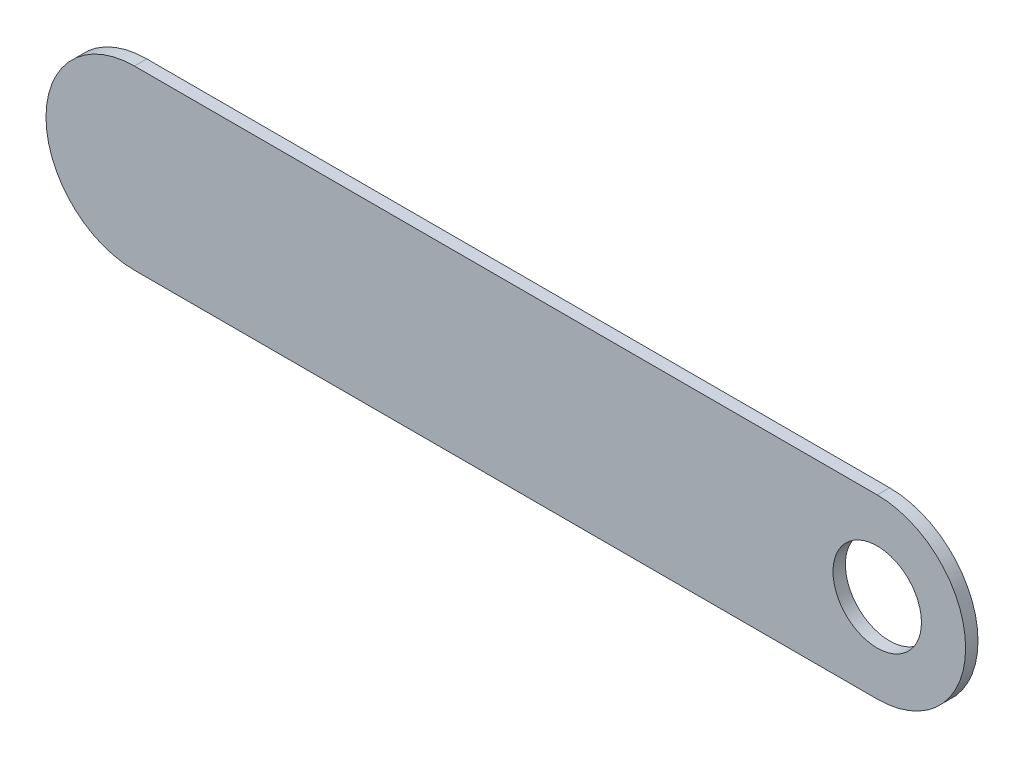
ISO-10303-21;
HEADER;
FILE_DESCRIPTION(('STEP AP214'),'2;1');
FILE_NAME('part.step','',(''),(''),'','','');
FILE_SCHEMA(('AUTOMOTIVE_DESIGN { 1 0 10303 214 1 1 1 1 }'));
ENDSEC;
DATA;
#1=APPLICATION_CONTEXT('core data for automotive mechanical design processes');
#2=APPLICATION_PROTOCOL_DEFINITION('international standard','automotive_design',2000,#1);
#3=PRODUCT_CONTEXT('',#1,'mechanical');
#4=PRODUCT('Part','Part','',(#3));
#5=PRODUCT_RELATED_PRODUCT_CATEGORY('part','',(#4));
#6=PRODUCT_DEFINITION_FORMATION('','',#4);
#7=PRODUCT_DEFINITION_CONTEXT('part definition',#1,'design');
#8=PRODUCT_DEFINITION('design','',#6,#7);
#9=PRODUCT_DEFINITION_SHAPE('','',#8);
#10=(LENGTH_UNIT() NAMED_UNIT(*) SI_UNIT(.MILLI.,.METRE.));
#11=(NAMED_UNIT(*) PLANE_ANGLE_UNIT() SI_UNIT($,.RADIAN.));
#12=(NAMED_UNIT(*) SI_UNIT($,.STERADIAN.) SOLID_ANGLE_UNIT());
#13=UNCERTAINTY_MEASURE_WITH_UNIT(LENGTH_MEASURE(1.E-05),#10,'distance_accuracy_value','');
#14=(GEOMETRIC_REPRESENTATION_CONTEXT(3) GLOBAL_UNCERTAINTY_ASSIGNED_CONTEXT((#13)) GLOBAL_UNIT_ASSIGNED_CONTEXT((#10,
#11,#12)) REPRESENTATION_CONTEXT('',''));
#15=CARTESIAN_POINT('',(0.,0.,0.));
#16=DIRECTION('',(0.,0.,1.));
#17=DIRECTION('',(1.,0.,0.));
#18=AXIS2_PLACEMENT_3D('',#15,#16,#17);
#19=CARTESIAN_POINT('',(94.25,-120.75,-0.045));
#20=DIRECTION('',(0.,0.,-1.));
#21=DIRECTION('',(0.,-1.,0.));
#22=AXIS2_PLACEMENT_3D('',#19,#20,#21);
#23=CYLINDRICAL_SURFACE('',#22,0.125);
#24=CARTESIAN_POINT('',(94.25,-120.75,-0.035));
#25=DIRECTION('',(0.,0.,-1.));
#26=DIRECTION('',(0.,-1.,0.));
#27=AXIS2_PLACEMENT_3D('',#24,#25,#26);
#28=CIRCLE('',#27,0.125);
#29=CARTESIAN_POINT('',(94.25,-120.875,-0.035));
#30=VERTEX_POINT('',#29);
#31=EDGE_CURVE('E76',#30,#30,#28,.T.);
#32=ORIENTED_EDGE('',*,*,#31,.T.);
#33=DIRECTION('',(0.,0.,1.));
#34=VECTOR('',#33,1.);
#35=CARTESIAN_POINT('',(94.25,-120.875,-0.045));
#36=LINE('',#35,#34);
#37=CARTESIAN_POINT('',(94.25,-120.875,0.));
#38=VERTEX_POINT('',#37);
#39=EDGE_CURVE('E11',#30,#38,#36,.T.);
#40=ORIENTED_EDGE('',*,*,#39,.T.);
#41=CARTESIAN_POINT('',(94.25,-120.75,0.));
#42=DIRECTION('',(0.,0.,-1.));
#43=DIRECTION('',(0.,-1.,0.));
#44=AXIS2_PLACEMENT_3D('',#41,#42,#43);
#45=CIRCLE('',#44,0.125);
#46=EDGE_CURVE('E20',#38,#38,#45,.T.);
#47=ORIENTED_EDGE('',*,*,#46,.F.);
#48=ORIENTED_EDGE('',*,*,#39,.F.);
#49=EDGE_LOOP('',(#32,#40,#47,#48));
#50=FACE_BOUND('',#49,.T.);
#51=ADVANCED_FACE('F17',(#50),#23,.F.);
#52=CARTESIAN_POINT('',(94.25,-120.5,-0.035));
#53=DIRECTION('',(0.,-1.,0.));
#54=DIRECTION('',(0.,0.,-1.));
#55=AXIS2_PLACEMENT_3D('',#52,#53,#54);
#56=PLANE('',#55);
#57=DIRECTION('',(-1.,0.,0.));
#58=VECTOR('',#57,1.);
#59=CARTESIAN_POINT('',(94.25,-120.5,-0.035));
#60=LINE('',#59,#58);
#61=CARTESIAN_POINT('',(94.25,-120.5,-0.035));
#62=VERTEX_POINT('',#61);
#63=CARTESIAN_POINT('',(92.15,-120.5,-0.035));
#64=VERTEX_POINT('',#63);
#65=EDGE_CURVE('E87',#62,#64,#60,.T.);
#66=ORIENTED_EDGE('',*,*,#65,.T.);
#67=DIRECTION('',(0.,0.,1.));
#68=VECTOR('',#67,1.);
#69=CARTESIAN_POINT('',(92.15,-120.5,-0.035));
#70=LINE('',#69,#68);
#71=CARTESIAN_POINT('',(92.15,-120.5,0.));
#72=VERTEX_POINT('',#71);
#73=EDGE_CURVE('E71',#64,#72,#70,.T.);
#74=ORIENTED_EDGE('',*,*,#73,.T.);
#75=DIRECTION('',(-1.,0.,0.));
#76=VECTOR('',#75,1.);
#77=CARTESIAN_POINT('',(94.25,-120.5,0.));
#78=LINE('',#77,#76);
#79=CARTESIAN_POINT('',(94.25,-120.5,0.));
#80=VERTEX_POINT('',#79);
#81=EDGE_CURVE('E64',#80,#72,#78,.T.);
#82=ORIENTED_EDGE('',*,*,#81,.F.);
#83=DIRECTION('',(0.,0.,1.));
#84=VECTOR('',#83,1.);
#85=CARTESIAN_POINT('',(94.25,-120.5,-0.035));
#86=LINE('',#85,#84);
#87=EDGE_CURVE('E68',#62,#80,#86,.T.);
#88=ORIENTED_EDGE('',*,*,#87,.F.);
#89=EDGE_LOOP('',(#66,#74,#82,#88));
#90=FACE_BOUND('',#89,.T.);
#91=ADVANCED_FACE('F66',(#90),#56,.F.);
#92=CARTESIAN_POINT('',(92.15,-121.,0.));
#93=DIRECTION('',(0.,0.,1.));
#94=DIRECTION('',(1.,0.,0.));
#95=AXIS2_PLACEMENT_3D('',#92,#93,#94);
#96=PLANE('',#95);
#97=ORIENTED_EDGE('',*,*,#46,.T.);
#98=EDGE_LOOP('',(#97));
#99=FACE_BOUND('',#98,.T.);
#100=DIRECTION('',(1.,0.,0.));
#101=VECTOR('',#100,1.);
#102=CARTESIAN_POINT('',(92.15,-121.,0.));
#103=LINE('',#102,#101);
#104=CARTESIAN_POINT('',(92.15,-121.,0.));
#105=VERTEX_POINT('',#104);
#106=CARTESIAN_POINT('',(94.25,-121.,0.));
#107=VERTEX_POINT('',#106);
#108=EDGE_CURVE('E82',#105,#107,#103,.T.);
#109=ORIENTED_EDGE('',*,*,#108,.T.);
#110=CARTESIAN_POINT('',(94.25,-120.75,0.));
#111=DIRECTION('',(0.,0.,1.));
#112=DIRECTION('',(0.,-1.,0.));
#113=AXIS2_PLACEMENT_3D('',#110,#111,#112);
#114=CIRCLE('',#113,0.25);
#115=EDGE_CURVE('E79',#107,#80,#114,.T.);
#116=ORIENTED_EDGE('',*,*,#115,.T.);
#117=ORIENTED_EDGE('',*,*,#81,.T.);
#118=CARTESIAN_POINT('',(92.15,-120.75,0.));
#119=DIRECTION('',(0.,0.,1.));
#120=DIRECTION('',(0.,1.,0.));
#121=AXIS2_PLACEMENT_3D('',#118,#119,#120);
#122=CIRCLE('',#121,0.25);
#123=EDGE_CURVE('E118',#72,#105,#122,.T.);
#124=ORIENTED_EDGE('',*,*,#123,.T.);
#125=EDGE_LOOP('',(#109,#116,#117,#124));
#126=FACE_BOUND('',#125,.T.);
#127=ADVANCED_FACE('F80',(#99,#126),#96,.T.);
#128=CARTESIAN_POINT('',(92.15,-121.,-0.035));
#129=DIRECTION('',(0.,0.,1.));
#130=DIRECTION('',(1.,0.,0.));
#131=AXIS2_PLACEMENT_3D('',#128,#129,#130);
#132=PLANE('',#131);
#133=ORIENTED_EDGE('',*,*,#31,.F.);
#134=EDGE_LOOP('',(#133));
#135=FACE_BOUND('',#134,.T.);
#136=CARTESIAN_POINT('',(92.15,-120.75,-0.035));
#137=DIRECTION('',(0.,0.,1.));
#138=DIRECTION('',(0.,1.,0.));
#139=AXIS2_PLACEMENT_3D('',#136,#137,#138);
#140=CIRCLE('',#139,0.25);
#141=CARTESIAN_POINT('',(92.15,-121.,-0.035));
#142=VERTEX_POINT('',#141);
#143=EDGE_CURVE('E113',#64,#142,#140,.T.);
#144=ORIENTED_EDGE('',*,*,#143,.F.);
#145=ORIENTED_EDGE('',*,*,#65,.F.);
#146=CARTESIAN_POINT('',(94.25,-120.75,-0.035));
#147=DIRECTION('',(0.,0.,1.));
#148=DIRECTION('',(0.,-1.,0.));
#149=AXIS2_PLACEMENT_3D('',#146,#147,#148);
#150=CIRCLE('',#149,0.25);
#151=CARTESIAN_POINT('',(94.25,-121.,-0.035));
#152=VERTEX_POINT('',#151);
#153=EDGE_CURVE('E91',#152,#62,#150,.T.);
#154=ORIENTED_EDGE('',*,*,#153,.F.);
#155=DIRECTION('',(1.,0.,0.));
#156=VECTOR('',#155,1.);
#157=CARTESIAN_POINT('',(92.15,-121.,-0.035));
#158=LINE('',#157,#156);
#159=EDGE_CURVE('E127',#142,#152,#158,.T.);
#160=ORIENTED_EDGE('',*,*,#159,.F.);
#161=EDGE_LOOP('',(#144,#145,#154,#160));
#162=FACE_BOUND('',#161,.T.);
#163=ADVANCED_FACE('F144',(#135,#162),#132,.F.);
#164=CARTESIAN_POINT('',(94.25,-120.75,-0.035));
#165=DIRECTION('',(0.,0.,-1.));
#166=DIRECTION('',(0.,-1.,0.));
#167=AXIS2_PLACEMENT_3D('',#164,#165,#166);
#168=CYLINDRICAL_SURFACE('',#167,0.25);
#169=ORIENTED_EDGE('',*,*,#153,.T.);
#170=ORIENTED_EDGE('',*,*,#87,.T.);
#171=ORIENTED_EDGE('',*,*,#115,.F.);
#172=DIRECTION('',(0.,0.,1.));
#173=VECTOR('',#172,1.);
#174=CARTESIAN_POINT('',(94.25,-121.,-0.035));
#175=LINE('',#174,#173);
#176=EDGE_CURVE('E128',#152,#107,#175,.T.);
#177=ORIENTED_EDGE('',*,*,#176,.F.);
#178=EDGE_LOOP('',(#169,#170,#171,#177));
#179=FACE_BOUND('',#178,.T.);
#180=ADVANCED_FACE('F89',(#179),#168,.T.);
#181=CARTESIAN_POINT('',(92.15,-120.75,-0.035));
#182=DIRECTION('',(0.,0.,-1.));
#183=DIRECTION('',(0.,1.,0.));
#184=AXIS2_PLACEMENT_3D('',#181,#182,#183);
#185=CYLINDRICAL_SURFACE('',#184,0.25);
#186=ORIENTED_EDGE('',*,*,#143,.T.);
#187=DIRECTION('',(0.,0.,1.));
#188=VECTOR('',#187,1.);
#189=CARTESIAN_POINT('',(92.15,-121.,-0.035));
#190=LINE('',#189,#188);
#191=EDGE_CURVE('E110',#142,#105,#190,.T.);
#192=ORIENTED_EDGE('',*,*,#191,.T.);
#193=ORIENTED_EDGE('',*,*,#123,.F.);
#194=ORIENTED_EDGE('',*,*,#73,.F.);
#195=EDGE_LOOP('',(#186,#192,#193,#194));
#196=FACE_BOUND('',#195,.T.);
#197=ADVANCED_FACE('F190',(#196),#185,.T.);
#198=CARTESIAN_POINT('',(92.15,-121.,-0.035));
#199=DIRECTION('',(0.,1.,0.));
#200=DIRECTION('',(1.,0.,0.));
#201=AXIS2_PLACEMENT_3D('',#198,#199,#200);
#202=PLANE('',#201);
#203=ORIENTED_EDGE('',*,*,#159,.T.);
#204=ORIENTED_EDGE('',*,*,#176,.T.);
#205=ORIENTED_EDGE('',*,*,#108,.F.);
#206=ORIENTED_EDGE('',*,*,#191,.F.);
#207=EDGE_LOOP('',(#203,#204,#205,#206));
#208=FACE_BOUND('',#207,.T.);
#209=ADVANCED_FACE('F140',(#208),#202,.F.);
#210=CLOSED_SHELL('',(#51,#91,#127,#163,#180,#197,#209));
#211=MANIFOLD_SOLID_BREP('B1',#210);
#212=ADVANCED_BREP_SHAPE_REPRESENTATION('',(#18,#211),#14);
#213=SHAPE_DEFINITION_REPRESENTATION(#9,#212);
ENDSEC;
END-ISO-10303-21;
